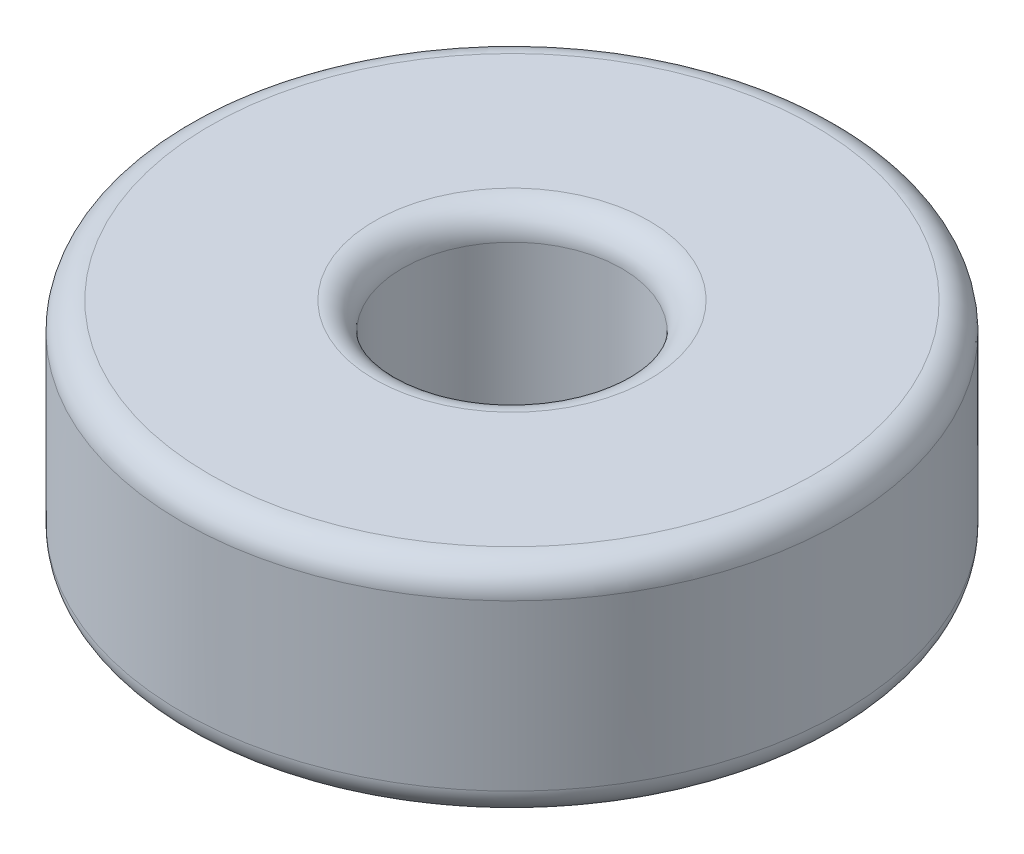
ISO-10303-21;
HEADER;
FILE_DESCRIPTION(('STEP AP214'),'2;1');
FILE_NAME('part.step','',(''),(''),'','','');
FILE_SCHEMA(('AUTOMOTIVE_DESIGN { 1 0 10303 214 1 1 1 1 }'));
ENDSEC;
DATA;
#1=APPLICATION_CONTEXT('core data for automotive mechanical design processes');
#2=APPLICATION_PROTOCOL_DEFINITION('international standard','automotive_design',2000,#1);
#3=PRODUCT_CONTEXT('',#1,'mechanical');
#4=PRODUCT('Part','Part','',(#3));
#5=PRODUCT_RELATED_PRODUCT_CATEGORY('part','',(#4));
#6=PRODUCT_DEFINITION_FORMATION('','',#4);
#7=PRODUCT_DEFINITION_CONTEXT('part definition',#1,'design');
#8=PRODUCT_DEFINITION('design','',#6,#7);
#9=PRODUCT_DEFINITION_SHAPE('','',#8);
#10=(LENGTH_UNIT() NAMED_UNIT(*) SI_UNIT(.MILLI.,.METRE.));
#11=(NAMED_UNIT(*) PLANE_ANGLE_UNIT() SI_UNIT($,.RADIAN.));
#12=(NAMED_UNIT(*) SI_UNIT($,.STERADIAN.) SOLID_ANGLE_UNIT());
#13=UNCERTAINTY_MEASURE_WITH_UNIT(LENGTH_MEASURE(1.E-05),#10,'distance_accuracy_value','');
#14=(GEOMETRIC_REPRESENTATION_CONTEXT(3) GLOBAL_UNCERTAINTY_ASSIGNED_CONTEXT((#13)) GLOBAL_UNIT_ASSIGNED_CONTEXT((#10,
#11,#12)) REPRESENTATION_CONTEXT('',''));
#15=CARTESIAN_POINT('',(0.,0.,0.));
#16=DIRECTION('',(0.,0.,1.));
#17=DIRECTION('',(1.,0.,0.));
#18=AXIS2_PLACEMENT_3D('',#15,#16,#17);
#19=CARTESIAN_POINT('',(0.,0.,0.));
#20=DIRECTION('',(0.,-1.,0.));
#21=DIRECTION('',(0.,0.,-1.));
#22=AXIS2_PLACEMENT_3D('',#19,#20,#21);
#23=CYLINDRICAL_SURFACE('',#22,2.);
#24=CARTESIAN_POINT('',(0.,0.5,0.));
#25=DIRECTION('',(0.,-1.,0.));
#26=DIRECTION('',(0.,0.,-1.));
#27=AXIS2_PLACEMENT_3D('',#24,#25,#26);
#28=CIRCLE('',#27,2.);
#29=CARTESIAN_POINT('',(0.,0.5,-2.));
#30=VERTEX_POINT('',#29);
#31=EDGE_CURVE('E59',#30,#30,#28,.T.);
#32=ORIENTED_EDGE('',*,*,#31,.T.);
#33=EDGE_LOOP('',(#32));
#34=FACE_BOUND('',#33,.T.);
#35=CARTESIAN_POINT('',(0.,3.5,0.));
#36=DIRECTION('',(0.,1.,0.));
#37=DIRECTION('',(0.,0.,1.));
#38=AXIS2_PLACEMENT_3D('',#35,#36,#37);
#39=CIRCLE('',#38,2.);
#40=CARTESIAN_POINT('',(0.,3.5,2.));
#41=VERTEX_POINT('',#40);
#42=EDGE_CURVE('E62',#41,#41,#39,.T.);
#43=ORIENTED_EDGE('',*,*,#42,.T.);
#44=EDGE_LOOP('',(#43));
#45=FACE_BOUND('',#44,.T.);
#46=ADVANCED_FACE('F33',(#34,#45),#23,.F.);
#47=CARTESIAN_POINT('',(2.,4.,0.));
#48=DIRECTION('',(0.,1.,0.));
#49=DIRECTION('',(0.,0.,1.));
#50=AXIS2_PLACEMENT_3D('',#47,#48,#49);
#51=PLANE('',#50);
#52=CARTESIAN_POINT('',(0.,4.,0.));
#53=DIRECTION('',(0.,1.,0.));
#54=DIRECTION('',(0.,0.,1.));
#55=AXIS2_PLACEMENT_3D('',#52,#53,#54);
#56=CIRCLE('',#55,5.5);
#57=CARTESIAN_POINT('',(0.,4.,5.5));
#58=VERTEX_POINT('',#57);
#59=EDGE_CURVE('E10',#58,#58,#56,.T.);
#60=ORIENTED_EDGE('',*,*,#59,.T.);
#61=EDGE_LOOP('',(#60));
#62=FACE_BOUND('',#61,.T.);
#63=CARTESIAN_POINT('',(0.,4.,0.));
#64=DIRECTION('',(0.,1.,0.));
#65=DIRECTION('',(0.,0.,1.));
#66=AXIS2_PLACEMENT_3D('',#63,#64,#65);
#67=CIRCLE('',#66,2.5);
#68=CARTESIAN_POINT('',(0.,4.,2.5));
#69=VERTEX_POINT('',#68);
#70=EDGE_CURVE('E40',#69,#69,#67,.F.);
#71=ORIENTED_EDGE('',*,*,#70,.T.);
#72=EDGE_LOOP('',(#71));
#73=FACE_BOUND('',#72,.T.);
#74=ADVANCED_FACE('F76',(#62,#73),#51,.T.);
#75=CARTESIAN_POINT('',(0.,0.,0.));
#76=DIRECTION('',(0.,-1.,0.));
#77=DIRECTION('',(0.,0.,-1.));
#78=AXIS2_PLACEMENT_3D('',#75,#76,#77);
#79=CYLINDRICAL_SURFACE('',#78,6.);
#80=CARTESIAN_POINT('',(0.,0.5,0.));
#81=DIRECTION('',(0.,-1.,0.));
#82=DIRECTION('',(0.,0.,-1.));
#83=AXIS2_PLACEMENT_3D('',#80,#81,#82);
#84=CIRCLE('',#83,6.);
#85=CARTESIAN_POINT('',(0.,0.5,-6.));
#86=VERTEX_POINT('',#85);
#87=EDGE_CURVE('E44',#86,#86,#84,.F.);
#88=ORIENTED_EDGE('',*,*,#87,.T.);
#89=EDGE_LOOP('',(#88));
#90=FACE_BOUND('',#89,.T.);
#91=CARTESIAN_POINT('',(0.,3.5,0.));
#92=DIRECTION('',(0.,1.,0.));
#93=DIRECTION('',(0.,0.,1.));
#94=AXIS2_PLACEMENT_3D('',#91,#92,#93);
#95=CIRCLE('',#94,6.);
#96=CARTESIAN_POINT('',(0.,3.5,6.));
#97=VERTEX_POINT('',#96);
#98=EDGE_CURVE('E48',#97,#97,#95,.F.);
#99=ORIENTED_EDGE('',*,*,#98,.T.);
#100=EDGE_LOOP('',(#99));
#101=FACE_BOUND('',#100,.T.);
#102=ADVANCED_FACE('F82',(#90,#101),#79,.T.);
#103=CARTESIAN_POINT('',(2.,0.,0.));
#104=DIRECTION('',(0.,-1.,0.));
#105=DIRECTION('',(0.,0.,-1.));
#106=AXIS2_PLACEMENT_3D('',#103,#104,#105);
#107=PLANE('',#106);
#108=CARTESIAN_POINT('',(0.,0.,0.));
#109=DIRECTION('',(0.,-1.,0.));
#110=DIRECTION('',(0.,0.,-1.));
#111=AXIS2_PLACEMENT_3D('',#108,#109,#110);
#112=CIRCLE('',#111,2.5);
#113=CARTESIAN_POINT('',(0.,0.,-2.5));
#114=VERTEX_POINT('',#113);
#115=EDGE_CURVE('E53',#114,#114,#112,.F.);
#116=ORIENTED_EDGE('',*,*,#115,.T.);
#117=EDGE_LOOP('',(#116));
#118=FACE_BOUND('',#117,.T.);
#119=CARTESIAN_POINT('',(0.,0.,0.));
#120=DIRECTION('',(0.,-1.,0.));
#121=DIRECTION('',(0.,0.,-1.));
#122=AXIS2_PLACEMENT_3D('',#119,#120,#121);
#123=CIRCLE('',#122,5.5);
#124=CARTESIAN_POINT('',(0.,0.,-5.5));
#125=VERTEX_POINT('',#124);
#126=EDGE_CURVE('E56',#125,#125,#123,.T.);
#127=ORIENTED_EDGE('',*,*,#126,.T.);
#128=EDGE_LOOP('',(#127));
#129=FACE_BOUND('',#128,.T.);
#130=ADVANCED_FACE('F89',(#118,#129),#107,.T.);
#131=CARTESIAN_POINT('',(0.,0.5,0.));
#132=DIRECTION('',(0.,-1.,0.));
#133=DIRECTION('',(0.,0.,-1.));
#134=AXIS2_PLACEMENT_3D('',#131,#132,#133);
#135=TOROIDAL_SURFACE('',#134,2.5,0.5);
#136=ORIENTED_EDGE('',*,*,#115,.F.);
#137=EDGE_LOOP('',(#136));
#138=FACE_BOUND('',#137,.T.);
#139=ORIENTED_EDGE('',*,*,#31,.F.);
#140=EDGE_LOOP('',(#139));
#141=FACE_BOUND('',#140,.T.);
#142=ADVANCED_FACE('F86',(#138,#141),#135,.T.);
#143=CARTESIAN_POINT('',(0.,0.5,0.));
#144=DIRECTION('',(0.,-1.,0.));
#145=DIRECTION('',(0.,0.,-1.));
#146=AXIS2_PLACEMENT_3D('',#143,#144,#145);
#147=TOROIDAL_SURFACE('',#146,5.5,0.5);
#148=ORIENTED_EDGE('',*,*,#87,.F.);
#149=EDGE_LOOP('',(#148));
#150=FACE_BOUND('',#149,.T.);
#151=ORIENTED_EDGE('',*,*,#126,.F.);
#152=EDGE_LOOP('',(#151));
#153=FACE_BOUND('',#152,.T.);
#154=ADVANCED_FACE('F73',(#150,#153),#147,.T.);
#155=CARTESIAN_POINT('',(0.,3.5,0.));
#156=DIRECTION('',(0.,1.,0.));
#157=DIRECTION('',(0.,0.,1.));
#158=AXIS2_PLACEMENT_3D('',#155,#156,#157);
#159=TOROIDAL_SURFACE('',#158,5.5,0.5);
#160=ORIENTED_EDGE('',*,*,#59,.F.);
#161=EDGE_LOOP('',(#160));
#162=FACE_BOUND('',#161,.T.);
#163=ORIENTED_EDGE('',*,*,#98,.F.);
#164=EDGE_LOOP('',(#163));
#165=FACE_BOUND('',#164,.T.);
#166=ADVANCED_FACE('F69',(#162,#165),#159,.T.);
#167=CARTESIAN_POINT('',(0.,3.5,0.));
#168=DIRECTION('',(0.,1.,0.));
#169=DIRECTION('',(0.,0.,1.));
#170=AXIS2_PLACEMENT_3D('',#167,#168,#169);
#171=TOROIDAL_SURFACE('',#170,2.5,0.5);
#172=ORIENTED_EDGE('',*,*,#42,.F.);
#173=EDGE_LOOP('',(#172));
#174=FACE_BOUND('',#173,.T.);
#175=ORIENTED_EDGE('',*,*,#70,.F.);
#176=EDGE_LOOP('',(#175));
#177=FACE_BOUND('',#176,.T.);
#178=ADVANCED_FACE('F35',(#174,#177),#171,.T.);
#179=CLOSED_SHELL('',(#46,#74,#102,#130,#142,#154,#166,#178));
#180=MANIFOLD_SOLID_BREP('B2',#179);
#181=ADVANCED_BREP_SHAPE_REPRESENTATION('',(#18,#180),#14);
#182=SHAPE_DEFINITION_REPRESENTATION(#9,#181);
ENDSEC;
END-ISO-10303-21;
